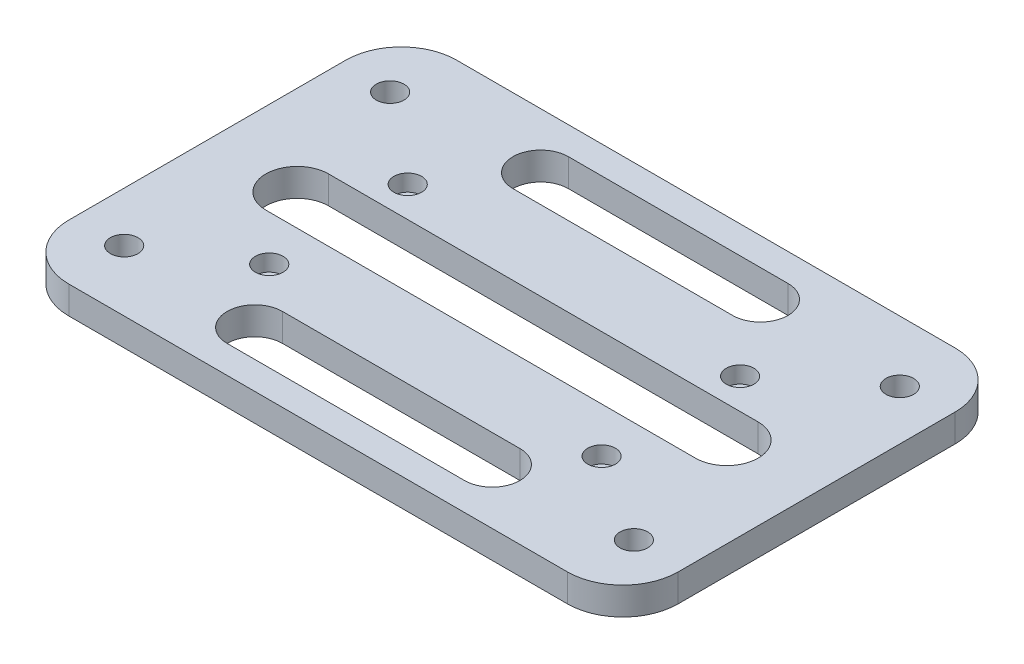
ISO-10303-21;
HEADER;
FILE_DESCRIPTION(('STEP AP214'),'2;1');
FILE_NAME('part.step','',(''),(''),'','','');
FILE_SCHEMA(('AUTOMOTIVE_DESIGN { 1 0 10303 214 1 1 1 1 }'));
ENDSEC;
DATA;
#1=APPLICATION_CONTEXT('core data for automotive mechanical design processes');
#2=APPLICATION_PROTOCOL_DEFINITION('international standard','automotive_design',2000,#1);
#3=PRODUCT_CONTEXT('',#1,'mechanical');
#4=PRODUCT('Part','Part','',(#3));
#5=PRODUCT_RELATED_PRODUCT_CATEGORY('part','',(#4));
#6=PRODUCT_DEFINITION_FORMATION('','',#4);
#7=PRODUCT_DEFINITION_CONTEXT('part definition',#1,'design');
#8=PRODUCT_DEFINITION('design','',#6,#7);
#9=PRODUCT_DEFINITION_SHAPE('','',#8);
#10=(LENGTH_UNIT() NAMED_UNIT(*) SI_UNIT(.MILLI.,.METRE.));
#11=(NAMED_UNIT(*) PLANE_ANGLE_UNIT() SI_UNIT($,.RADIAN.));
#12=(NAMED_UNIT(*) SI_UNIT($,.STERADIAN.) SOLID_ANGLE_UNIT());
#13=UNCERTAINTY_MEASURE_WITH_UNIT(LENGTH_MEASURE(1.E-05),#10,'distance_accuracy_value','');
#14=(GEOMETRIC_REPRESENTATION_CONTEXT(3) GLOBAL_UNCERTAINTY_ASSIGNED_CONTEXT((#13)) GLOBAL_UNIT_ASSIGNED_CONTEXT((#10,
#11,#12)) REPRESENTATION_CONTEXT('',''));
#15=CARTESIAN_POINT('',(0.,0.,0.));
#16=DIRECTION('',(0.,0.,1.));
#17=DIRECTION('',(1.,0.,0.));
#18=AXIS2_PLACEMENT_3D('',#15,#16,#17);
#19=CARTESIAN_POINT('',(85.,0.,-46.1767788666769));
#20=DIRECTION('',(0.,1.,0.));
#21=DIRECTION('',(0.,0.,1.));
#22=AXIS2_PLACEMENT_3D('',#19,#20,#21);
#23=CYLINDRICAL_SURFACE('',#22,1.29999999999999);
#24=CARTESIAN_POINT('',(85.,0.,-46.1767788666769));
#25=DIRECTION('',(0.,1.,0.));
#26=DIRECTION('',(0.,0.,1.));
#27=AXIS2_PLACEMENT_3D('',#24,#25,#26);
#28=CIRCLE('',#27,1.29999999999999);
#29=CARTESIAN_POINT('',(85.,0.,-44.8767788666769));
#30=VERTEX_POINT('',#29);
#31=EDGE_CURVE('E312',#30,#30,#28,.T.);
#32=ORIENTED_EDGE('',*,*,#31,.F.);
#33=EDGE_LOOP('',(#32));
#34=FACE_BOUND('',#33,.T.);
#35=CARTESIAN_POINT('',(85.,2.,-46.1767788666769));
#36=DIRECTION('',(0.,1.,0.));
#37=DIRECTION('',(0.,0.,1.));
#38=AXIS2_PLACEMENT_3D('',#35,#36,#37);
#39=CIRCLE('',#38,1.29999999999999);
#40=CARTESIAN_POINT('',(85.,2.,-44.8767788666769));
#41=VERTEX_POINT('',#40);
#42=EDGE_CURVE('E315',#41,#41,#39,.F.);
#43=ORIENTED_EDGE('',*,*,#42,.F.);
#44=EDGE_LOOP('',(#43));
#45=FACE_BOUND('',#44,.T.);
#46=ADVANCED_FACE('F35',(#34,#45),#23,.F.);
#47=CARTESIAN_POINT('',(85.,0.,-21.1767788666769));
#48=DIRECTION('',(0.,1.,0.));
#49=DIRECTION('',(0.,0.,1.));
#50=AXIS2_PLACEMENT_3D('',#47,#48,#49);
#51=CYLINDRICAL_SURFACE('',#50,1.29999999999999);
#52=CARTESIAN_POINT('',(85.,0.,-21.1767788666769));
#53=DIRECTION('',(0.,1.,0.));
#54=DIRECTION('',(0.,0.,1.));
#55=AXIS2_PLACEMENT_3D('',#52,#53,#54);
#56=CIRCLE('',#55,1.29999999999999);
#57=CARTESIAN_POINT('',(85.,0.,-19.8767788666769));
#58=VERTEX_POINT('',#57);
#59=EDGE_CURVE('E309',#58,#58,#56,.T.);
#60=ORIENTED_EDGE('',*,*,#59,.F.);
#61=EDGE_LOOP('',(#60));
#62=FACE_BOUND('',#61,.T.);
#63=CARTESIAN_POINT('',(85.,2.,-21.1767788666769));
#64=DIRECTION('',(0.,1.,0.));
#65=DIRECTION('',(0.,0.,1.));
#66=AXIS2_PLACEMENT_3D('',#63,#64,#65);
#67=CIRCLE('',#66,1.29999999999999);
#68=CARTESIAN_POINT('',(85.,2.,-19.8767788666769));
#69=VERTEX_POINT('',#68);
#70=EDGE_CURVE('E369',#69,#69,#67,.F.);
#71=ORIENTED_EDGE('',*,*,#70,.F.);
#72=EDGE_LOOP('',(#71));
#73=FACE_BOUND('',#72,.T.);
#74=ADVANCED_FACE('F440',(#62,#73),#51,.F.);
#75=CARTESIAN_POINT('',(25.,0.,-21.1767788666769));
#76=DIRECTION('',(0.,1.,0.));
#77=DIRECTION('',(0.,0.,1.));
#78=AXIS2_PLACEMENT_3D('',#75,#76,#77);
#79=CYLINDRICAL_SURFACE('',#78,1.3);
#80=CARTESIAN_POINT('',(25.,0.,-21.1767788666769));
#81=DIRECTION('',(0.,1.,0.));
#82=DIRECTION('',(0.,0.,1.));
#83=AXIS2_PLACEMENT_3D('',#80,#81,#82);
#84=CIRCLE('',#83,1.3);
#85=CARTESIAN_POINT('',(25.,0.,-19.8767788666769));
#86=VERTEX_POINT('',#85);
#87=EDGE_CURVE('E305',#86,#86,#84,.T.);
#88=ORIENTED_EDGE('',*,*,#87,.F.);
#89=EDGE_LOOP('',(#88));
#90=FACE_BOUND('',#89,.T.);
#91=CARTESIAN_POINT('',(25.,2.,-21.1767788666769));
#92=DIRECTION('',(0.,1.,0.));
#93=DIRECTION('',(0.,0.,1.));
#94=AXIS2_PLACEMENT_3D('',#91,#92,#93);
#95=CIRCLE('',#94,1.3);
#96=CARTESIAN_POINT('',(25.,2.,-19.8767788666769));
#97=VERTEX_POINT('',#96);
#98=EDGE_CURVE('E366',#97,#97,#95,.F.);
#99=ORIENTED_EDGE('',*,*,#98,.F.);
#100=EDGE_LOOP('',(#99));
#101=FACE_BOUND('',#100,.T.);
#102=ADVANCED_FACE('F446',(#90,#101),#79,.F.);
#103=CARTESIAN_POINT('',(25.,0.,-46.1767788666769));
#104=DIRECTION('',(0.,1.,0.));
#105=DIRECTION('',(0.,0.,1.));
#106=AXIS2_PLACEMENT_3D('',#103,#104,#105);
#107=CYLINDRICAL_SURFACE('',#106,1.3);
#108=CARTESIAN_POINT('',(25.,0.,-46.1767788666769));
#109=DIRECTION('',(0.,1.,0.));
#110=DIRECTION('',(0.,0.,1.));
#111=AXIS2_PLACEMENT_3D('',#108,#109,#110);
#112=CIRCLE('',#111,1.3);
#113=CARTESIAN_POINT('',(25.,0.,-44.8767788666769));
#114=VERTEX_POINT('',#113);
#115=EDGE_CURVE('E308',#114,#114,#112,.T.);
#116=ORIENTED_EDGE('',*,*,#115,.F.);
#117=EDGE_LOOP('',(#116));
#118=FACE_BOUND('',#117,.T.);
#119=CARTESIAN_POINT('',(25.,2.,-46.1767788666769));
#120=DIRECTION('',(0.,1.,0.));
#121=DIRECTION('',(0.,0.,1.));
#122=AXIS2_PLACEMENT_3D('',#119,#120,#121);
#123=CIRCLE('',#122,1.3);
#124=CARTESIAN_POINT('',(25.,2.,-44.8767788666769));
#125=VERTEX_POINT('',#124);
#126=EDGE_CURVE('E302',#125,#125,#123,.F.);
#127=ORIENTED_EDGE('',*,*,#126,.F.);
#128=EDGE_LOOP('',(#127));
#129=FACE_BOUND('',#128,.T.);
#130=ADVANCED_FACE('F467',(#118,#129),#107,.F.);
#131=CARTESIAN_POINT('',(0.,5.,0.));
#132=DIRECTION('',(1.,0.,0.));
#133=DIRECTION('',(0.,0.,-1.));
#134=AXIS2_PLACEMENT_3D('',#131,#132,#133);
#135=PLANE('',#134);
#136=DIRECTION('',(0.,0.,1.));
#137=VECTOR('',#136,1.);
#138=CARTESIAN_POINT('',(0.,0.,0.));
#139=LINE('',#138,#137);
#140=CARTESIAN_POINT('',(0.,0.,-60.));
#141=VERTEX_POINT('',#140);
#142=CARTESIAN_POINT('',(0.,0.,-10.));
#143=VERTEX_POINT('',#142);
#144=EDGE_CURVE('E340',#141,#143,#139,.T.);
#145=ORIENTED_EDGE('',*,*,#144,.T.);
#146=DIRECTION('',(0.,-1.,0.));
#147=VECTOR('',#146,1.);
#148=CARTESIAN_POINT('',(0.,5.,-10.));
#149=LINE('',#148,#147);
#150=CARTESIAN_POINT('',(0.,5.,-10.));
#151=VERTEX_POINT('',#150);
#152=EDGE_CURVE('E11',#143,#151,#149,.F.);
#153=ORIENTED_EDGE('',*,*,#152,.T.);
#154=DIRECTION('',(0.,0.,1.));
#155=VECTOR('',#154,1.);
#156=CARTESIAN_POINT('',(0.,5.,0.));
#157=LINE('',#156,#155);
#158=CARTESIAN_POINT('',(0.,5.,-60.));
#159=VERTEX_POINT('',#158);
#160=EDGE_CURVE('E343',#159,#151,#157,.T.);
#161=ORIENTED_EDGE('',*,*,#160,.F.);
#162=DIRECTION('',(0.,-1.,0.));
#163=VECTOR('',#162,1.);
#164=CARTESIAN_POINT('',(0.,5.,-60.));
#165=LINE('',#164,#163);
#166=EDGE_CURVE('E43',#159,#141,#165,.T.);
#167=ORIENTED_EDGE('',*,*,#166,.T.);
#168=EDGE_LOOP('',(#145,#153,#161,#167));
#169=FACE_BOUND('',#168,.T.);
#170=ADVANCED_FACE('F406',(#169),#135,.F.);
#171=CARTESIAN_POINT('',(0.,5.,0.));
#172=DIRECTION('',(0.,0.,-1.));
#173=DIRECTION('',(-1.,0.,0.));
#174=AXIS2_PLACEMENT_3D('',#171,#172,#173);
#175=PLANE('',#174);
#176=DIRECTION('',(1.,0.,0.));
#177=VECTOR('',#176,1.);
#178=CARTESIAN_POINT('',(0.,0.,0.));
#179=LINE('',#178,#177);
#180=CARTESIAN_POINT('',(10.,0.,0.));
#181=VERTEX_POINT('',#180);
#182=CARTESIAN_POINT('',(100.,0.,0.));
#183=VERTEX_POINT('',#182);
#184=EDGE_CURVE('E357',#181,#183,#179,.T.);
#185=ORIENTED_EDGE('',*,*,#184,.T.);
#186=DIRECTION('',(0.,-1.,0.));
#187=VECTOR('',#186,1.);
#188=CARTESIAN_POINT('',(100.,5.,0.));
#189=LINE('',#188,#187);
#190=CARTESIAN_POINT('',(100.,5.,0.));
#191=VERTEX_POINT('',#190);
#192=EDGE_CURVE('E50',#183,#191,#189,.F.);
#193=ORIENTED_EDGE('',*,*,#192,.T.);
#194=DIRECTION('',(1.,0.,0.));
#195=VECTOR('',#194,1.);
#196=CARTESIAN_POINT('',(0.,5.,0.));
#197=LINE('',#196,#195);
#198=CARTESIAN_POINT('',(10.,5.,0.));
#199=VERTEX_POINT('',#198);
#200=EDGE_CURVE('E345',#199,#191,#197,.T.);
#201=ORIENTED_EDGE('',*,*,#200,.F.);
#202=DIRECTION('',(0.,-1.,0.));
#203=VECTOR('',#202,1.);
#204=CARTESIAN_POINT('',(10.,5.,0.));
#205=LINE('',#204,#203);
#206=EDGE_CURVE('E398',#199,#181,#205,.T.);
#207=ORIENTED_EDGE('',*,*,#206,.T.);
#208=EDGE_LOOP('',(#185,#193,#201,#207));
#209=FACE_BOUND('',#208,.T.);
#210=ADVANCED_FACE('F416',(#209),#175,.F.);
#211=CARTESIAN_POINT('',(110.,5.,0.));
#212=DIRECTION('',(-1.,0.,0.));
#213=DIRECTION('',(0.,0.,1.));
#214=AXIS2_PLACEMENT_3D('',#211,#212,#213);
#215=PLANE('',#214);
#216=DIRECTION('',(0.,0.,-1.));
#217=VECTOR('',#216,1.);
#218=CARTESIAN_POINT('',(110.,0.,0.));
#219=LINE('',#218,#217);
#220=CARTESIAN_POINT('',(110.,0.,-10.));
#221=VERTEX_POINT('',#220);
#222=CARTESIAN_POINT('',(110.,0.,-60.));
#223=VERTEX_POINT('',#222);
#224=EDGE_CURVE('E359',#221,#223,#219,.T.);
#225=ORIENTED_EDGE('',*,*,#224,.T.);
#226=DIRECTION('',(0.,-1.,0.));
#227=VECTOR('',#226,1.);
#228=CARTESIAN_POINT('',(110.,5.,-60.));
#229=LINE('',#228,#227);
#230=CARTESIAN_POINT('',(110.,5.,-60.));
#231=VERTEX_POINT('',#230);
#232=EDGE_CURVE('E389',#223,#231,#229,.F.);
#233=ORIENTED_EDGE('',*,*,#232,.T.);
#234=DIRECTION('',(0.,0.,-1.));
#235=VECTOR('',#234,1.);
#236=CARTESIAN_POINT('',(110.,5.,0.));
#237=LINE('',#236,#235);
#238=CARTESIAN_POINT('',(110.,5.,-10.));
#239=VERTEX_POINT('',#238);
#240=EDGE_CURVE('E348',#239,#231,#237,.T.);
#241=ORIENTED_EDGE('',*,*,#240,.F.);
#242=DIRECTION('',(0.,-1.,0.));
#243=VECTOR('',#242,1.);
#244=CARTESIAN_POINT('',(110.,5.,-10.));
#245=LINE('',#244,#243);
#246=EDGE_CURVE('E386',#239,#221,#245,.T.);
#247=ORIENTED_EDGE('',*,*,#246,.T.);
#248=EDGE_LOOP('',(#225,#233,#241,#247));
#249=FACE_BOUND('',#248,.T.);
#250=ADVANCED_FACE('F425',(#249),#215,.F.);
#251=CARTESIAN_POINT('',(0.,5.,-70.));
#252=DIRECTION('',(0.,0.,1.));
#253=DIRECTION('',(1.,0.,0.));
#254=AXIS2_PLACEMENT_3D('',#251,#252,#253);
#255=PLANE('',#254);
#256=DIRECTION('',(-1.,0.,0.));
#257=VECTOR('',#256,1.);
#258=CARTESIAN_POINT('',(0.,5.,-70.));
#259=LINE('',#258,#257);
#260=CARTESIAN_POINT('',(100.,5.,-70.));
#261=VERTEX_POINT('',#260);
#262=CARTESIAN_POINT('',(10.,5.,-70.));
#263=VERTEX_POINT('',#262);
#264=EDGE_CURVE('E351',#261,#263,#259,.T.);
#265=ORIENTED_EDGE('',*,*,#264,.F.);
#266=DIRECTION('',(0.,-1.,0.));
#267=VECTOR('',#266,1.);
#268=CARTESIAN_POINT('',(100.,5.,-70.));
#269=LINE('',#268,#267);
#270=CARTESIAN_POINT('',(100.,0.,-70.));
#271=VERTEX_POINT('',#270);
#272=EDGE_CURVE('E375',#261,#271,#269,.T.);
#273=ORIENTED_EDGE('',*,*,#272,.T.);
#274=DIRECTION('',(-1.,0.,0.));
#275=VECTOR('',#274,1.);
#276=CARTESIAN_POINT('',(0.,0.,-70.));
#277=LINE('',#276,#275);
#278=CARTESIAN_POINT('',(10.,0.,-70.));
#279=VERTEX_POINT('',#278);
#280=EDGE_CURVE('E346',#271,#279,#277,.T.);
#281=ORIENTED_EDGE('',*,*,#280,.T.);
#282=DIRECTION('',(0.,-1.,0.));
#283=VECTOR('',#282,1.);
#284=CARTESIAN_POINT('',(10.,5.,-70.));
#285=LINE('',#284,#283);
#286=EDGE_CURVE('E354',#279,#263,#285,.F.);
#287=ORIENTED_EDGE('',*,*,#286,.T.);
#288=EDGE_LOOP('',(#265,#273,#281,#287));
#289=FACE_BOUND('',#288,.T.);
#290=ADVANCED_FACE('F433',(#289),#255,.F.);
#291=CARTESIAN_POINT('',(0.,5.,0.));
#292=DIRECTION('',(0.,-1.,0.));
#293=DIRECTION('',(0.,0.,-1.));
#294=AXIS2_PLACEMENT_3D('',#291,#292,#293);
#295=PLANE('',#294);
#296=DIRECTION('',(1.,0.,0.));
#297=VECTOR('',#296,1.);
#298=CARTESIAN_POINT('',(35.1751469043261,5.,-55.));
#299=LINE('',#298,#297);
#300=CARTESIAN_POINT('',(35.1751469043261,5.,-55.));
#301=VERTEX_POINT('',#300);
#302=CARTESIAN_POINT('',(74.8248530956739,5.,-55.));
#303=VERTEX_POINT('',#302);
#304=EDGE_CURVE('E207',#301,#303,#299,.T.);
#305=ORIENTED_EDGE('',*,*,#304,.F.);
#306=CARTESIAN_POINT('',(35.1751469043261,5.,-60.));
#307=DIRECTION('',(0.,1.,0.));
#308=DIRECTION('',(0.,0.,1.));
#309=AXIS2_PLACEMENT_3D('',#306,#307,#308);
#310=CIRCLE('',#309,5.00000000000001);
#311=CARTESIAN_POINT('',(35.1751469043261,5.,-65.));
#312=VERTEX_POINT('',#311);
#313=EDGE_CURVE('E180',#312,#301,#310,.T.);
#314=ORIENTED_EDGE('',*,*,#313,.F.);
#315=DIRECTION('',(-1.,0.,0.));
#316=VECTOR('',#315,1.);
#317=CARTESIAN_POINT('',(35.1751469043261,5.,-65.));
#318=LINE('',#317,#316);
#319=CARTESIAN_POINT('',(74.8248530956739,5.,-65.));
#320=VERTEX_POINT('',#319);
#321=EDGE_CURVE('E198',#320,#312,#318,.T.);
#322=ORIENTED_EDGE('',*,*,#321,.F.);
#323=CARTESIAN_POINT('',(74.8248530956739,5.,-60.));
#324=DIRECTION('',(0.,1.,0.));
#325=DIRECTION('',(0.,0.,1.));
#326=AXIS2_PLACEMENT_3D('',#323,#324,#325);
#327=CIRCLE('',#326,5.00000000000001);
#328=EDGE_CURVE('E201',#303,#320,#327,.T.);
#329=ORIENTED_EDGE('',*,*,#328,.F.);
#330=EDGE_LOOP('',(#305,#314,#322,#329));
#331=FACE_BOUND('',#330,.T.);
#332=DIRECTION('',(1.,0.,0.));
#333=VECTOR('',#332,1.);
#334=CARTESIAN_POINT('',(16.2260905317542,5.,-29.3402659652281));
#335=LINE('',#334,#333);
#336=CARTESIAN_POINT('',(16.2260905317542,5.,-29.3402659652281));
#337=VERTEX_POINT('',#336);
#338=CARTESIAN_POINT('',(93.7739094682458,5.,-29.3402659652281));
#339=VERTEX_POINT('',#338);
#340=EDGE_CURVE('E234',#337,#339,#335,.T.);
#341=ORIENTED_EDGE('',*,*,#340,.F.);
#342=CARTESIAN_POINT('',(16.2260905317542,5.,-35.));
#343=DIRECTION('',(0.,1.,0.));
#344=DIRECTION('',(0.,0.,1.));
#345=AXIS2_PLACEMENT_3D('',#342,#343,#344);
#346=CIRCLE('',#345,5.65973403477189);
#347=CARTESIAN_POINT('',(16.2260905317542,5.,-40.6597340347719));
#348=VERTEX_POINT('',#347);
#349=EDGE_CURVE('E232',#348,#337,#346,.T.);
#350=ORIENTED_EDGE('',*,*,#349,.F.);
#351=DIRECTION('',(-1.,0.,0.));
#352=VECTOR('',#351,1.);
#353=CARTESIAN_POINT('',(16.2260905317542,5.,-40.6597340347719));
#354=LINE('',#353,#352);
#355=CARTESIAN_POINT('',(93.7739094682458,5.,-40.6597340347719));
#356=VERTEX_POINT('',#355);
#357=EDGE_CURVE('E222',#356,#348,#354,.T.);
#358=ORIENTED_EDGE('',*,*,#357,.F.);
#359=CARTESIAN_POINT('',(93.7739094682458,5.,-35.));
#360=DIRECTION('',(0.,1.,0.));
#361=DIRECTION('',(0.,0.,1.));
#362=AXIS2_PLACEMENT_3D('',#359,#360,#361);
#363=CIRCLE('',#362,5.65973403477189);
#364=EDGE_CURVE('E238',#339,#356,#363,.T.);
#365=ORIENTED_EDGE('',*,*,#364,.F.);
#366=EDGE_LOOP('',(#341,#350,#358,#365));
#367=FACE_BOUND('',#366,.T.);
#368=DIRECTION('',(1.,0.,0.));
#369=VECTOR('',#368,1.);
#370=CARTESIAN_POINT('',(33.5667372332332,5.,-5.));
#371=LINE('',#370,#369);
#372=CARTESIAN_POINT('',(33.5667372332332,5.,-5.));
#373=VERTEX_POINT('',#372);
#374=CARTESIAN_POINT('',(76.4332627667668,5.,-5.));
#375=VERTEX_POINT('',#374);
#376=EDGE_CURVE('E266',#373,#375,#371,.T.);
#377=ORIENTED_EDGE('',*,*,#376,.F.);
#378=CARTESIAN_POINT('',(33.5667372332332,5.,-10.));
#379=DIRECTION('',(0.,1.,0.));
#380=DIRECTION('',(0.,0.,1.));
#381=AXIS2_PLACEMENT_3D('',#378,#379,#380);
#382=CIRCLE('',#381,5.);
#383=CARTESIAN_POINT('',(33.5667372332332,5.,-15.));
#384=VERTEX_POINT('',#383);
#385=EDGE_CURVE('E264',#384,#373,#382,.T.);
#386=ORIENTED_EDGE('',*,*,#385,.F.);
#387=DIRECTION('',(-1.,0.,0.));
#388=VECTOR('',#387,1.);
#389=CARTESIAN_POINT('',(33.5667372332332,5.,-15.));
#390=LINE('',#389,#388);
#391=CARTESIAN_POINT('',(76.4332627667668,5.,-15.));
#392=VERTEX_POINT('',#391);
#393=EDGE_CURVE('E254',#392,#384,#390,.T.);
#394=ORIENTED_EDGE('',*,*,#393,.F.);
#395=CARTESIAN_POINT('',(76.4332627667668,5.,-10.));
#396=DIRECTION('',(0.,1.,0.));
#397=DIRECTION('',(0.,0.,1.));
#398=AXIS2_PLACEMENT_3D('',#395,#396,#397);
#399=CIRCLE('',#398,5.);
#400=EDGE_CURVE('E269',#375,#392,#399,.T.);
#401=ORIENTED_EDGE('',*,*,#400,.F.);
#402=EDGE_LOOP('',(#377,#386,#394,#401));
#403=FACE_BOUND('',#402,.T.);
#404=CARTESIAN_POINT('',(85.,5.,-46.1767788666769));
#405=DIRECTION('',(0.,1.,0.));
#406=DIRECTION('',(0.,0.,1.));
#407=AXIS2_PLACEMENT_3D('',#404,#405,#406);
#408=CIRCLE('',#407,2.5);
#409=CARTESIAN_POINT('',(85.,5.,-43.6767788666769));
#410=VERTEX_POINT('',#409);
#411=EDGE_CURVE('E214',#410,#410,#408,.T.);
#412=ORIENTED_EDGE('',*,*,#411,.F.);
#413=EDGE_LOOP('',(#412));
#414=FACE_BOUND('',#413,.T.);
#415=CARTESIAN_POINT('',(85.,5.,-21.1767788666769));
#416=DIRECTION('',(0.,1.,0.));
#417=DIRECTION('',(0.,0.,1.));
#418=AXIS2_PLACEMENT_3D('',#415,#416,#417);
#419=CIRCLE('',#418,2.5);
#420=CARTESIAN_POINT('',(85.,5.,-18.6767788666769));
#421=VERTEX_POINT('',#420);
#422=EDGE_CURVE('E291',#421,#421,#419,.T.);
#423=ORIENTED_EDGE('',*,*,#422,.F.);
#424=EDGE_LOOP('',(#423));
#425=FACE_BOUND('',#424,.T.);
#426=CARTESIAN_POINT('',(25.,5.,-21.1767788666769));
#427=DIRECTION('',(0.,1.,0.));
#428=DIRECTION('',(0.,0.,1.));
#429=AXIS2_PLACEMENT_3D('',#426,#427,#428);
#430=CIRCLE('',#429,2.5);
#431=CARTESIAN_POINT('',(25.,5.,-18.6767788666769));
#432=VERTEX_POINT('',#431);
#433=EDGE_CURVE('E285',#432,#432,#430,.T.);
#434=ORIENTED_EDGE('',*,*,#433,.F.);
#435=EDGE_LOOP('',(#434));
#436=FACE_BOUND('',#435,.T.);
#437=CARTESIAN_POINT('',(25.,5.,-46.1767788666769));
#438=DIRECTION('',(0.,1.,0.));
#439=DIRECTION('',(0.,0.,1.));
#440=AXIS2_PLACEMENT_3D('',#437,#438,#439);
#441=CIRCLE('',#440,2.5);
#442=CARTESIAN_POINT('',(25.,5.,-43.6767788666769));
#443=VERTEX_POINT('',#442);
#444=EDGE_CURVE('E284',#443,#443,#441,.T.);
#445=ORIENTED_EDGE('',*,*,#444,.F.);
#446=EDGE_LOOP('',(#445));
#447=FACE_BOUND('',#446,.T.);
#448=CARTESIAN_POINT('',(9.00000000000001,5.,-11.));
#449=DIRECTION('',(0.,1.,0.));
#450=DIRECTION('',(0.,0.,1.));
#451=AXIS2_PLACEMENT_3D('',#448,#449,#450);
#452=CIRCLE('',#451,2.5);
#453=CARTESIAN_POINT('',(9.00000000000001,5.,-8.5));
#454=VERTEX_POINT('',#453);
#455=EDGE_CURVE('E320',#454,#454,#452,.T.);
#456=ORIENTED_EDGE('',*,*,#455,.F.);
#457=EDGE_LOOP('',(#456));
#458=FACE_BOUND('',#457,.T.);
#459=CARTESIAN_POINT('',(101.,5.,-11.));
#460=DIRECTION('',(0.,1.,0.));
#461=DIRECTION('',(0.,0.,1.));
#462=AXIS2_PLACEMENT_3D('',#459,#460,#461);
#463=CIRCLE('',#462,2.5);
#464=CARTESIAN_POINT('',(101.,5.,-8.50000000000002));
#465=VERTEX_POINT('',#464);
#466=EDGE_CURVE('E326',#465,#465,#463,.T.);
#467=ORIENTED_EDGE('',*,*,#466,.F.);
#468=EDGE_LOOP('',(#467));
#469=FACE_BOUND('',#468,.T.);
#470=CARTESIAN_POINT('',(101.,5.,-59.));
#471=DIRECTION('',(0.,1.,0.));
#472=DIRECTION('',(0.,0.,1.));
#473=AXIS2_PLACEMENT_3D('',#470,#471,#472);
#474=CIRCLE('',#473,2.5);
#475=CARTESIAN_POINT('',(101.,5.,-56.5));
#476=VERTEX_POINT('',#475);
#477=EDGE_CURVE('E332',#476,#476,#474,.T.);
#478=ORIENTED_EDGE('',*,*,#477,.F.);
#479=EDGE_LOOP('',(#478));
#480=FACE_BOUND('',#479,.T.);
#481=CARTESIAN_POINT('',(9.00000000000001,5.,-59.));
#482=DIRECTION('',(0.,1.,0.));
#483=DIRECTION('',(0.,0.,1.));
#484=AXIS2_PLACEMENT_3D('',#481,#482,#483);
#485=CIRCLE('',#484,2.5);
#486=CARTESIAN_POINT('',(9.00000000000001,5.,-56.5));
#487=VERTEX_POINT('',#486);
#488=EDGE_CURVE('E319',#487,#487,#485,.T.);
#489=ORIENTED_EDGE('',*,*,#488,.F.);
#490=EDGE_LOOP('',(#489));
#491=FACE_BOUND('',#490,.T.);
#492=ORIENTED_EDGE('',*,*,#240,.T.);
#493=CARTESIAN_POINT('',(100.,5.,-60.));
#494=DIRECTION('',(0.,-1.,0.));
#495=DIRECTION('',(0.,0.,-1.));
#496=AXIS2_PLACEMENT_3D('',#493,#494,#495);
#497=CIRCLE('',#496,10.);
#498=EDGE_CURVE('E396',#231,#261,#497,.F.);
#499=ORIENTED_EDGE('',*,*,#498,.T.);
#500=ORIENTED_EDGE('',*,*,#264,.T.);
#501=CARTESIAN_POINT('',(10.,5.,-60.));
#502=DIRECTION('',(0.,-1.,0.));
#503=DIRECTION('',(0.,0.,-1.));
#504=AXIS2_PLACEMENT_3D('',#501,#502,#503);
#505=CIRCLE('',#504,10.);
#506=EDGE_CURVE('E391',#263,#159,#505,.F.);
#507=ORIENTED_EDGE('',*,*,#506,.T.);
#508=ORIENTED_EDGE('',*,*,#160,.T.);
#509=CARTESIAN_POINT('',(10.,5.,-10.));
#510=DIRECTION('',(0.,-1.,0.));
#511=DIRECTION('',(0.,0.,-1.));
#512=AXIS2_PLACEMENT_3D('',#509,#510,#511);
#513=CIRCLE('',#512,10.);
#514=EDGE_CURVE('E57',#151,#199,#513,.F.);
#515=ORIENTED_EDGE('',*,*,#514,.T.);
#516=ORIENTED_EDGE('',*,*,#200,.T.);
#517=CARTESIAN_POINT('',(100.,5.,-10.));
#518=DIRECTION('',(0.,-1.,0.));
#519=DIRECTION('',(0.,0.,-1.));
#520=AXIS2_PLACEMENT_3D('',#517,#518,#519);
#521=CIRCLE('',#520,10.);
#522=EDGE_CURVE('E394',#191,#239,#521,.F.);
#523=ORIENTED_EDGE('',*,*,#522,.T.);
#524=EDGE_LOOP('',(#492,#499,#500,#507,#508,#515,#516,#523));
#525=FACE_BOUND('',#524,.T.);
#526=ADVANCED_FACE('F418',(#331,#367,#403,#414,#425,#436,#447,#458,#469,#480,#491,#525),#295,.F.);
#527=CARTESIAN_POINT('',(0.,0.,0.));
#528=DIRECTION('',(0.,-1.,0.));
#529=DIRECTION('',(0.,0.,-1.));
#530=AXIS2_PLACEMENT_3D('',#527,#528,#529);
#531=PLANE('',#530);
#532=CARTESIAN_POINT('',(35.1751469043261,0.,-60.));
#533=DIRECTION('',(0.,1.,0.));
#534=DIRECTION('',(0.,0.,1.));
#535=AXIS2_PLACEMENT_3D('',#532,#533,#534);
#536=CIRCLE('',#535,5.00000000000001);
#537=CARTESIAN_POINT('',(35.1751469043261,0.,-65.));
#538=VERTEX_POINT('',#537);
#539=CARTESIAN_POINT('',(35.1751469043261,0.,-55.));
#540=VERTEX_POINT('',#539);
#541=EDGE_CURVE('E177',#538,#540,#536,.T.);
#542=ORIENTED_EDGE('',*,*,#541,.T.);
#543=DIRECTION('',(1.,0.,0.));
#544=VECTOR('',#543,1.);
#545=CARTESIAN_POINT('',(35.1751469043261,0.,-55.));
#546=LINE('',#545,#544);
#547=CARTESIAN_POINT('',(74.8248530956739,0.,-55.));
#548=VERTEX_POINT('',#547);
#549=EDGE_CURVE('E189',#540,#548,#546,.T.);
#550=ORIENTED_EDGE('',*,*,#549,.T.);
#551=CARTESIAN_POINT('',(74.8248530956739,0.,-60.));
#552=DIRECTION('',(0.,1.,0.));
#553=DIRECTION('',(0.,0.,1.));
#554=AXIS2_PLACEMENT_3D('',#551,#552,#553);
#555=CIRCLE('',#554,5.00000000000001);
#556=CARTESIAN_POINT('',(74.8248530956739,0.,-65.));
#557=VERTEX_POINT('',#556);
#558=EDGE_CURVE('E193',#548,#557,#555,.T.);
#559=ORIENTED_EDGE('',*,*,#558,.T.);
#560=DIRECTION('',(-1.,0.,0.));
#561=VECTOR('',#560,1.);
#562=CARTESIAN_POINT('',(35.1751469043261,0.,-65.));
#563=LINE('',#562,#561);
#564=EDGE_CURVE('E185',#557,#538,#563,.T.);
#565=ORIENTED_EDGE('',*,*,#564,.T.);
#566=EDGE_LOOP('',(#542,#550,#559,#565));
#567=FACE_BOUND('',#566,.T.);
#568=CARTESIAN_POINT('',(16.2260905317542,0.,-35.));
#569=DIRECTION('',(0.,1.,0.));
#570=DIRECTION('',(0.,0.,1.));
#571=AXIS2_PLACEMENT_3D('',#568,#569,#570);
#572=CIRCLE('',#571,5.65973403477189);
#573=CARTESIAN_POINT('',(16.2260905317542,0.,-40.6597340347719));
#574=VERTEX_POINT('',#573);
#575=CARTESIAN_POINT('',(16.2260905317542,0.,-29.3402659652281));
#576=VERTEX_POINT('',#575);
#577=EDGE_CURVE('E218',#574,#576,#572,.T.);
#578=ORIENTED_EDGE('',*,*,#577,.T.);
#579=DIRECTION('',(1.,0.,0.));
#580=VECTOR('',#579,1.);
#581=CARTESIAN_POINT('',(16.2260905317542,0.,-29.3402659652281));
#582=LINE('',#581,#580);
#583=CARTESIAN_POINT('',(93.7739094682458,0.,-29.3402659652281));
#584=VERTEX_POINT('',#583);
#585=EDGE_CURVE('E221',#576,#584,#582,.T.);
#586=ORIENTED_EDGE('',*,*,#585,.T.);
#587=CARTESIAN_POINT('',(93.7739094682458,0.,-35.));
#588=DIRECTION('',(0.,1.,0.));
#589=DIRECTION('',(0.,0.,1.));
#590=AXIS2_PLACEMENT_3D('',#587,#588,#589);
#591=CIRCLE('',#590,5.65973403477189);
#592=CARTESIAN_POINT('',(93.7739094682458,0.,-40.6597340347719));
#593=VERTEX_POINT('',#592);
#594=EDGE_CURVE('E225',#584,#593,#591,.T.);
#595=ORIENTED_EDGE('',*,*,#594,.T.);
#596=DIRECTION('',(-1.,0.,0.));
#597=VECTOR('',#596,1.);
#598=CARTESIAN_POINT('',(16.2260905317542,0.,-40.6597340347719));
#599=LINE('',#598,#597);
#600=EDGE_CURVE('E228',#593,#574,#599,.T.);
#601=ORIENTED_EDGE('',*,*,#600,.T.);
#602=EDGE_LOOP('',(#578,#586,#595,#601));
#603=FACE_BOUND('',#602,.T.);
#604=CARTESIAN_POINT('',(33.5667372332332,0.,-10.));
#605=DIRECTION('',(0.,1.,0.));
#606=DIRECTION('',(0.,0.,1.));
#607=AXIS2_PLACEMENT_3D('',#604,#605,#606);
#608=CIRCLE('',#607,5.);
#609=CARTESIAN_POINT('',(33.5667372332332,0.,-15.));
#610=VERTEX_POINT('',#609);
#611=CARTESIAN_POINT('',(33.5667372332332,0.,-5.));
#612=VERTEX_POINT('',#611);
#613=EDGE_CURVE('E250',#610,#612,#608,.T.);
#614=ORIENTED_EDGE('',*,*,#613,.T.);
#615=DIRECTION('',(1.,0.,0.));
#616=VECTOR('',#615,1.);
#617=CARTESIAN_POINT('',(33.5667372332332,0.,-5.));
#618=LINE('',#617,#616);
#619=CARTESIAN_POINT('',(76.4332627667668,0.,-5.));
#620=VERTEX_POINT('',#619);
#621=EDGE_CURVE('E253',#612,#620,#618,.T.);
#622=ORIENTED_EDGE('',*,*,#621,.T.);
#623=CARTESIAN_POINT('',(76.4332627667668,0.,-10.));
#624=DIRECTION('',(0.,1.,0.));
#625=DIRECTION('',(0.,0.,1.));
#626=AXIS2_PLACEMENT_3D('',#623,#624,#625);
#627=CIRCLE('',#626,5.);
#628=CARTESIAN_POINT('',(76.4332627667668,0.,-15.));
#629=VERTEX_POINT('',#628);
#630=EDGE_CURVE('E257',#620,#629,#627,.T.);
#631=ORIENTED_EDGE('',*,*,#630,.T.);
#632=DIRECTION('',(-1.,0.,0.));
#633=VECTOR('',#632,1.);
#634=CARTESIAN_POINT('',(33.5667372332332,0.,-15.));
#635=LINE('',#634,#633);
#636=EDGE_CURVE('E260',#629,#610,#635,.T.);
#637=ORIENTED_EDGE('',*,*,#636,.T.);
#638=EDGE_LOOP('',(#614,#622,#631,#637));
#639=FACE_BOUND('',#638,.T.);
#640=CARTESIAN_POINT('',(9.00000000000001,0.,-11.));
#641=DIRECTION('',(0.,1.,0.));
#642=DIRECTION('',(0.,0.,1.));
#643=AXIS2_PLACEMENT_3D('',#640,#641,#642);
#644=CIRCLE('',#643,2.5);
#645=CARTESIAN_POINT('',(9.00000000000001,0.,-8.5));
#646=VERTEX_POINT('',#645);
#647=EDGE_CURVE('E316',#646,#646,#644,.T.);
#648=ORIENTED_EDGE('',*,*,#647,.T.);
#649=EDGE_LOOP('',(#648));
#650=FACE_BOUND('',#649,.T.);
#651=CARTESIAN_POINT('',(101.,0.,-11.));
#652=DIRECTION('',(0.,1.,0.));
#653=DIRECTION('',(0.,0.,1.));
#654=AXIS2_PLACEMENT_3D('',#651,#652,#653);
#655=CIRCLE('',#654,2.5);
#656=CARTESIAN_POINT('',(101.,0.,-8.50000000000002));
#657=VERTEX_POINT('',#656);
#658=EDGE_CURVE('E323',#657,#657,#655,.T.);
#659=ORIENTED_EDGE('',*,*,#658,.T.);
#660=EDGE_LOOP('',(#659));
#661=FACE_BOUND('',#660,.T.);
#662=CARTESIAN_POINT('',(101.,0.,-59.));
#663=DIRECTION('',(0.,1.,0.));
#664=DIRECTION('',(0.,0.,1.));
#665=AXIS2_PLACEMENT_3D('',#662,#663,#664);
#666=CIRCLE('',#665,2.5);
#667=CARTESIAN_POINT('',(101.,0.,-56.5));
#668=VERTEX_POINT('',#667);
#669=EDGE_CURVE('E329',#668,#668,#666,.T.);
#670=ORIENTED_EDGE('',*,*,#669,.T.);
#671=EDGE_LOOP('',(#670));
#672=FACE_BOUND('',#671,.T.);
#673=ORIENTED_EDGE('',*,*,#115,.T.);
#674=EDGE_LOOP('',(#673));
#675=FACE_BOUND('',#674,.T.);
#676=ORIENTED_EDGE('',*,*,#87,.T.);
#677=EDGE_LOOP('',(#676));
#678=FACE_BOUND('',#677,.T.);
#679=ORIENTED_EDGE('',*,*,#59,.T.);
#680=EDGE_LOOP('',(#679));
#681=FACE_BOUND('',#680,.T.);
#682=ORIENTED_EDGE('',*,*,#31,.T.);
#683=EDGE_LOOP('',(#682));
#684=FACE_BOUND('',#683,.T.);
#685=CARTESIAN_POINT('',(9.00000000000001,0.,-59.));
#686=DIRECTION('',(0.,1.,0.));
#687=DIRECTION('',(0.,0.,1.));
#688=AXIS2_PLACEMENT_3D('',#685,#686,#687);
#689=CIRCLE('',#688,2.5);
#690=CARTESIAN_POINT('',(9.00000000000001,0.,-56.5));
#691=VERTEX_POINT('',#690);
#692=EDGE_CURVE('E337',#691,#691,#689,.T.);
#693=ORIENTED_EDGE('',*,*,#692,.T.);
#694=EDGE_LOOP('',(#693));
#695=FACE_BOUND('',#694,.T.);
#696=ORIENTED_EDGE('',*,*,#280,.F.);
#697=CARTESIAN_POINT('',(100.,0.,-60.));
#698=DIRECTION('',(0.,-1.,0.));
#699=DIRECTION('',(0.,0.,-1.));
#700=AXIS2_PLACEMENT_3D('',#697,#698,#699);
#701=CIRCLE('',#700,10.);
#702=EDGE_CURVE('E384',#271,#223,#701,.T.);
#703=ORIENTED_EDGE('',*,*,#702,.T.);
#704=ORIENTED_EDGE('',*,*,#224,.F.);
#705=CARTESIAN_POINT('',(100.,0.,-10.));
#706=DIRECTION('',(0.,-1.,0.));
#707=DIRECTION('',(0.,0.,-1.));
#708=AXIS2_PLACEMENT_3D('',#705,#706,#707);
#709=CIRCLE('',#708,10.);
#710=EDGE_CURVE('E382',#221,#183,#709,.T.);
#711=ORIENTED_EDGE('',*,*,#710,.T.);
#712=ORIENTED_EDGE('',*,*,#184,.F.);
#713=CARTESIAN_POINT('',(10.,0.,-10.));
#714=DIRECTION('',(0.,-1.,0.));
#715=DIRECTION('',(0.,0.,-1.));
#716=AXIS2_PLACEMENT_3D('',#713,#714,#715);
#717=CIRCLE('',#716,10.);
#718=EDGE_CURVE('E380',#181,#143,#717,.T.);
#719=ORIENTED_EDGE('',*,*,#718,.T.);
#720=ORIENTED_EDGE('',*,*,#144,.F.);
#721=CARTESIAN_POINT('',(10.,0.,-60.));
#722=DIRECTION('',(0.,-1.,0.));
#723=DIRECTION('',(0.,0.,-1.));
#724=AXIS2_PLACEMENT_3D('',#721,#722,#723);
#725=CIRCLE('',#724,10.);
#726=EDGE_CURVE('E378',#141,#279,#725,.T.);
#727=ORIENTED_EDGE('',*,*,#726,.T.);
#728=EDGE_LOOP('',(#696,#703,#704,#711,#712,#719,#720,#727));
#729=FACE_BOUND('',#728,.T.);
#730=ADVANCED_FACE('F195',(#567,#603,#639,#650,#661,#672,#675,#678,#681,#684,#695,#729),#531,.T.);
#731=CARTESIAN_POINT('',(9.00000000000001,0.,-59.));
#732=DIRECTION('',(0.,1.,0.));
#733=DIRECTION('',(0.,0.,1.));
#734=AXIS2_PLACEMENT_3D('',#731,#732,#733);
#735=CYLINDRICAL_SURFACE('',#734,2.5);
#736=ORIENTED_EDGE('',*,*,#692,.F.);
#737=EDGE_LOOP('',(#736));
#738=FACE_BOUND('',#737,.T.);
#739=ORIENTED_EDGE('',*,*,#488,.T.);
#740=EDGE_LOOP('',(#739));
#741=FACE_BOUND('',#740,.T.);
#742=ADVANCED_FACE('F465',(#738,#741),#735,.F.);
#743=CARTESIAN_POINT('',(101.,0.,-59.));
#744=DIRECTION('',(0.,1.,0.));
#745=DIRECTION('',(0.,0.,1.));
#746=AXIS2_PLACEMENT_3D('',#743,#744,#745);
#747=CYLINDRICAL_SURFACE('',#746,2.5);
#748=ORIENTED_EDGE('',*,*,#669,.F.);
#749=EDGE_LOOP('',(#748));
#750=FACE_BOUND('',#749,.T.);
#751=ORIENTED_EDGE('',*,*,#477,.T.);
#752=EDGE_LOOP('',(#751));
#753=FACE_BOUND('',#752,.T.);
#754=ADVANCED_FACE('F461',(#750,#753),#747,.F.);
#755=CARTESIAN_POINT('',(101.,0.,-11.));
#756=DIRECTION('',(0.,1.,0.));
#757=DIRECTION('',(0.,0.,1.));
#758=AXIS2_PLACEMENT_3D('',#755,#756,#757);
#759=CYLINDRICAL_SURFACE('',#758,2.5);
#760=ORIENTED_EDGE('',*,*,#658,.F.);
#761=EDGE_LOOP('',(#760));
#762=FACE_BOUND('',#761,.T.);
#763=ORIENTED_EDGE('',*,*,#466,.T.);
#764=EDGE_LOOP('',(#763));
#765=FACE_BOUND('',#764,.T.);
#766=ADVANCED_FACE('F457',(#762,#765),#759,.F.);
#767=CARTESIAN_POINT('',(9.00000000000001,0.,-11.));
#768=DIRECTION('',(0.,1.,0.));
#769=DIRECTION('',(0.,0.,1.));
#770=AXIS2_PLACEMENT_3D('',#767,#768,#769);
#771=CYLINDRICAL_SURFACE('',#770,2.5);
#772=ORIENTED_EDGE('',*,*,#647,.F.);
#773=EDGE_LOOP('',(#772));
#774=FACE_BOUND('',#773,.T.);
#775=ORIENTED_EDGE('',*,*,#455,.T.);
#776=EDGE_LOOP('',(#775));
#777=FACE_BOUND('',#776,.T.);
#778=ADVANCED_FACE('F453',(#774,#777),#771,.F.);
#779=CARTESIAN_POINT('',(25.,2.,-46.1767788666769));
#780=DIRECTION('',(0.,1.,0.));
#781=DIRECTION('',(0.,0.,1.));
#782=AXIS2_PLACEMENT_3D('',#779,#780,#781);
#783=PLANE('',#782);
#784=CARTESIAN_POINT('',(25.,2.,-46.1767788666769));
#785=DIRECTION('',(0.,1.,0.));
#786=DIRECTION('',(0.,0.,1.));
#787=AXIS2_PLACEMENT_3D('',#784,#785,#786);
#788=CIRCLE('',#787,2.5);
#789=CARTESIAN_POINT('',(25.,2.,-43.6767788666769));
#790=VERTEX_POINT('',#789);
#791=EDGE_CURVE('E299',#790,#790,#788,.T.);
#792=ORIENTED_EDGE('',*,*,#791,.T.);
#793=EDGE_LOOP('',(#792));
#794=FACE_BOUND('',#793,.T.);
#795=ORIENTED_EDGE('',*,*,#126,.T.);
#796=EDGE_LOOP('',(#795));
#797=FACE_BOUND('',#796,.T.);
#798=ADVANCED_FACE('F456',(#794,#797),#783,.T.);
#799=CARTESIAN_POINT('',(25.,2.,-46.1767788666769));
#800=DIRECTION('',(0.,1.,0.));
#801=DIRECTION('',(0.,0.,1.));
#802=AXIS2_PLACEMENT_3D('',#799,#800,#801);
#803=CYLINDRICAL_SURFACE('',#802,2.5);
#804=ORIENTED_EDGE('',*,*,#791,.F.);
#805=EDGE_LOOP('',(#804));
#806=FACE_BOUND('',#805,.T.);
#807=ORIENTED_EDGE('',*,*,#444,.T.);
#808=EDGE_LOOP('',(#807));
#809=FACE_BOUND('',#808,.T.);
#810=ADVANCED_FACE('F668',(#806,#809),#803,.F.);
#811=CARTESIAN_POINT('',(25.,2.,-21.1767788666769));
#812=DIRECTION('',(0.,1.,0.));
#813=DIRECTION('',(0.,0.,1.));
#814=AXIS2_PLACEMENT_3D('',#811,#812,#813);
#815=PLANE('',#814);
#816=CARTESIAN_POINT('',(25.,2.,-21.1767788666769));
#817=DIRECTION('',(0.,1.,0.));
#818=DIRECTION('',(0.,0.,1.));
#819=AXIS2_PLACEMENT_3D('',#816,#817,#818);
#820=CIRCLE('',#819,2.5);
#821=CARTESIAN_POINT('',(25.,2.,-18.6767788666769));
#822=VERTEX_POINT('',#821);
#823=EDGE_CURVE('E281',#822,#822,#820,.T.);
#824=ORIENTED_EDGE('',*,*,#823,.T.);
#825=EDGE_LOOP('',(#824));
#826=FACE_BOUND('',#825,.T.);
#827=ORIENTED_EDGE('',*,*,#98,.T.);
#828=EDGE_LOOP('',(#827));
#829=FACE_BOUND('',#828,.T.);
#830=ADVANCED_FACE('F659',(#826,#829),#815,.T.);
#831=CARTESIAN_POINT('',(25.,2.,-21.1767788666769));
#832=DIRECTION('',(0.,1.,0.));
#833=DIRECTION('',(0.,0.,1.));
#834=AXIS2_PLACEMENT_3D('',#831,#832,#833);
#835=CYLINDRICAL_SURFACE('',#834,2.5);
#836=ORIENTED_EDGE('',*,*,#823,.F.);
#837=EDGE_LOOP('',(#836));
#838=FACE_BOUND('',#837,.T.);
#839=ORIENTED_EDGE('',*,*,#433,.T.);
#840=EDGE_LOOP('',(#839));
#841=FACE_BOUND('',#840,.T.);
#842=ADVANCED_FACE('F650',(#838,#841),#835,.F.);
#843=CARTESIAN_POINT('',(85.,2.,-21.1767788666769));
#844=DIRECTION('',(0.,1.,0.));
#845=DIRECTION('',(0.,0.,1.));
#846=AXIS2_PLACEMENT_3D('',#843,#844,#845);
#847=PLANE('',#846);
#848=CARTESIAN_POINT('',(85.,2.,-21.1767788666769));
#849=DIRECTION('',(0.,1.,0.));
#850=DIRECTION('',(0.,0.,1.));
#851=AXIS2_PLACEMENT_3D('',#848,#849,#850);
#852=CIRCLE('',#851,2.5);
#853=CARTESIAN_POINT('',(85.,2.,-18.6767788666769));
#854=VERTEX_POINT('',#853);
#855=EDGE_CURVE('E288',#854,#854,#852,.T.);
#856=ORIENTED_EDGE('',*,*,#855,.T.);
#857=EDGE_LOOP('',(#856));
#858=FACE_BOUND('',#857,.T.);
#859=ORIENTED_EDGE('',*,*,#70,.T.);
#860=EDGE_LOOP('',(#859));
#861=FACE_BOUND('',#860,.T.);
#862=ADVANCED_FACE('F641',(#858,#861),#847,.T.);
#863=CARTESIAN_POINT('',(85.,2.,-21.1767788666769));
#864=DIRECTION('',(0.,1.,0.));
#865=DIRECTION('',(0.,0.,1.));
#866=AXIS2_PLACEMENT_3D('',#863,#864,#865);
#867=CYLINDRICAL_SURFACE('',#866,2.5);
#868=ORIENTED_EDGE('',*,*,#855,.F.);
#869=EDGE_LOOP('',(#868));
#870=FACE_BOUND('',#869,.T.);
#871=ORIENTED_EDGE('',*,*,#422,.T.);
#872=EDGE_LOOP('',(#871));
#873=FACE_BOUND('',#872,.T.);
#874=ADVANCED_FACE('F632',(#870,#873),#867,.F.);
#875=CARTESIAN_POINT('',(85.,2.,-46.1767788666769));
#876=DIRECTION('',(0.,1.,0.));
#877=DIRECTION('',(0.,0.,1.));
#878=AXIS2_PLACEMENT_3D('',#875,#876,#877);
#879=PLANE('',#878);
#880=CARTESIAN_POINT('',(85.,2.,-46.1767788666769));
#881=DIRECTION('',(0.,1.,0.));
#882=DIRECTION('',(0.,0.,1.));
#883=AXIS2_PLACEMENT_3D('',#880,#881,#882);
#884=CIRCLE('',#883,2.5);
#885=CARTESIAN_POINT('',(85.,2.,-43.6767788666769));
#886=VERTEX_POINT('',#885);
#887=EDGE_CURVE('E294',#886,#886,#884,.T.);
#888=ORIENTED_EDGE('',*,*,#887,.T.);
#889=EDGE_LOOP('',(#888));
#890=FACE_BOUND('',#889,.T.);
#891=ORIENTED_EDGE('',*,*,#42,.T.);
#892=EDGE_LOOP('',(#891));
#893=FACE_BOUND('',#892,.T.);
#894=ADVANCED_FACE('F623',(#890,#893),#879,.T.);
#895=CARTESIAN_POINT('',(85.,2.,-46.1767788666769));
#896=DIRECTION('',(0.,1.,0.));
#897=DIRECTION('',(0.,0.,1.));
#898=AXIS2_PLACEMENT_3D('',#895,#896,#897);
#899=CYLINDRICAL_SURFACE('',#898,2.5);
#900=ORIENTED_EDGE('',*,*,#887,.F.);
#901=EDGE_LOOP('',(#900));
#902=FACE_BOUND('',#901,.T.);
#903=ORIENTED_EDGE('',*,*,#411,.T.);
#904=EDGE_LOOP('',(#903));
#905=FACE_BOUND('',#904,.T.);
#906=ADVANCED_FACE('F614',(#902,#905),#899,.F.);
#907=CARTESIAN_POINT('',(33.5667372332332,0.,-10.));
#908=DIRECTION('',(0.,1.,0.));
#909=DIRECTION('',(0.,0.,1.));
#910=AXIS2_PLACEMENT_3D('',#907,#908,#909);
#911=CYLINDRICAL_SURFACE('',#910,5.);
#912=ORIENTED_EDGE('',*,*,#385,.T.);
#913=DIRECTION('',(0.,1.,0.));
#914=VECTOR('',#913,1.);
#915=CARTESIAN_POINT('',(33.5667372332332,0.,-5.));
#916=LINE('',#915,#914);
#917=EDGE_CURVE('E263',#612,#373,#916,.T.);
#918=ORIENTED_EDGE('',*,*,#917,.F.);
#919=ORIENTED_EDGE('',*,*,#613,.F.);
#920=DIRECTION('',(0.,1.,0.));
#921=VECTOR('',#920,1.);
#922=CARTESIAN_POINT('',(33.5667372332332,0.,-15.));
#923=LINE('',#922,#921);
#924=EDGE_CURVE('E235',#610,#384,#923,.T.);
#925=ORIENTED_EDGE('',*,*,#924,.T.);
#926=EDGE_LOOP('',(#912,#918,#919,#925));
#927=FACE_BOUND('',#926,.T.);
#928=ADVANCED_FACE('F605',(#927),#911,.F.);
#929=CARTESIAN_POINT('',(33.5667372332332,0.,-15.));
#930=DIRECTION('',(0.,0.,-1.));
#931=DIRECTION('',(-1.,0.,0.));
#932=AXIS2_PLACEMENT_3D('',#929,#930,#931);
#933=PLANE('',#932);
#934=ORIENTED_EDGE('',*,*,#393,.T.);
#935=ORIENTED_EDGE('',*,*,#924,.F.);
#936=ORIENTED_EDGE('',*,*,#636,.F.);
#937=DIRECTION('',(0.,1.,0.));
#938=VECTOR('',#937,1.);
#939=CARTESIAN_POINT('',(76.4332627667668,0.,-15.));
#940=LINE('',#939,#938);
#941=EDGE_CURVE('E275',#629,#392,#940,.T.);
#942=ORIENTED_EDGE('',*,*,#941,.T.);
#943=EDGE_LOOP('',(#934,#935,#936,#942));
#944=FACE_BOUND('',#943,.T.);
#945=ADVANCED_FACE('F596',(#944),#933,.F.);
#946=CARTESIAN_POINT('',(76.4332627667668,0.,-10.));
#947=DIRECTION('',(0.,1.,0.));
#948=DIRECTION('',(0.,0.,1.));
#949=AXIS2_PLACEMENT_3D('',#946,#947,#948);
#950=CYLINDRICAL_SURFACE('',#949,5.);
#951=ORIENTED_EDGE('',*,*,#400,.T.);
#952=ORIENTED_EDGE('',*,*,#941,.F.);
#953=ORIENTED_EDGE('',*,*,#630,.F.);
#954=DIRECTION('',(0.,1.,0.));
#955=VECTOR('',#954,1.);
#956=CARTESIAN_POINT('',(76.4332627667668,0.,-5.));
#957=LINE('',#956,#955);
#958=EDGE_CURVE('E277',#620,#375,#957,.T.);
#959=ORIENTED_EDGE('',*,*,#958,.T.);
#960=EDGE_LOOP('',(#951,#952,#953,#959));
#961=FACE_BOUND('',#960,.T.);
#962=ADVANCED_FACE('F587',(#961),#950,.F.);
#963=CARTESIAN_POINT('',(33.5667372332332,0.,-5.));
#964=DIRECTION('',(0.,0.,1.));
#965=DIRECTION('',(1.,0.,0.));
#966=AXIS2_PLACEMENT_3D('',#963,#964,#965);
#967=PLANE('',#966);
#968=ORIENTED_EDGE('',*,*,#376,.T.);
#969=ORIENTED_EDGE('',*,*,#958,.F.);
#970=ORIENTED_EDGE('',*,*,#621,.F.);
#971=ORIENTED_EDGE('',*,*,#917,.T.);
#972=EDGE_LOOP('',(#968,#969,#970,#971));
#973=FACE_BOUND('',#972,.T.);
#974=ADVANCED_FACE('F578',(#973),#967,.F.);
#975=CARTESIAN_POINT('',(16.2260905317542,0.,-35.));
#976=DIRECTION('',(0.,1.,0.));
#977=DIRECTION('',(0.,0.,1.));
#978=AXIS2_PLACEMENT_3D('',#975,#976,#977);
#979=CYLINDRICAL_SURFACE('',#978,5.65973403477189);
#980=ORIENTED_EDGE('',*,*,#349,.T.);
#981=DIRECTION('',(0.,1.,0.));
#982=VECTOR('',#981,1.);
#983=CARTESIAN_POINT('',(16.2260905317542,0.,-29.3402659652281));
#984=LINE('',#983,#982);
#985=EDGE_CURVE('E231',#576,#337,#984,.T.);
#986=ORIENTED_EDGE('',*,*,#985,.F.);
#987=ORIENTED_EDGE('',*,*,#577,.F.);
#988=DIRECTION('',(0.,1.,0.));
#989=VECTOR('',#988,1.);
#990=CARTESIAN_POINT('',(16.2260905317542,0.,-40.6597340347719));
#991=LINE('',#990,#989);
#992=EDGE_CURVE('E208',#574,#348,#991,.T.);
#993=ORIENTED_EDGE('',*,*,#992,.T.);
#994=EDGE_LOOP('',(#980,#986,#987,#993));
#995=FACE_BOUND('',#994,.T.);
#996=ADVANCED_FACE('F569',(#995),#979,.F.);
#997=CARTESIAN_POINT('',(16.2260905317542,0.,-40.6597340347719));
#998=DIRECTION('',(0.,0.,-1.));
#999=DIRECTION('',(-1.,0.,0.));
#1000=AXIS2_PLACEMENT_3D('',#997,#998,#999);
#1001=PLANE('',#1000);
#1002=ORIENTED_EDGE('',*,*,#357,.T.);
#1003=ORIENTED_EDGE('',*,*,#992,.F.);
#1004=ORIENTED_EDGE('',*,*,#600,.F.);
#1005=DIRECTION('',(0.,1.,0.));
#1006=VECTOR('',#1005,1.);
#1007=CARTESIAN_POINT('',(93.7739094682458,0.,-40.6597340347719));
#1008=LINE('',#1007,#1006);
#1009=EDGE_CURVE('E244',#593,#356,#1008,.T.);
#1010=ORIENTED_EDGE('',*,*,#1009,.T.);
#1011=EDGE_LOOP('',(#1002,#1003,#1004,#1010));
#1012=FACE_BOUND('',#1011,.T.);
#1013=ADVANCED_FACE('F560',(#1012),#1001,.F.);
#1014=CARTESIAN_POINT('',(93.7739094682458,0.,-35.));
#1015=DIRECTION('',(0.,1.,0.));
#1016=DIRECTION('',(0.,0.,1.));
#1017=AXIS2_PLACEMENT_3D('',#1014,#1015,#1016);
#1018=CYLINDRICAL_SURFACE('',#1017,5.65973403477189);
#1019=ORIENTED_EDGE('',*,*,#364,.T.);
#1020=ORIENTED_EDGE('',*,*,#1009,.F.);
#1021=ORIENTED_EDGE('',*,*,#594,.F.);
#1022=DIRECTION('',(0.,1.,0.));
#1023=VECTOR('',#1022,1.);
#1024=CARTESIAN_POINT('',(93.7739094682458,0.,-29.3402659652281));
#1025=LINE('',#1024,#1023);
#1026=EDGE_CURVE('E246',#584,#339,#1025,.T.);
#1027=ORIENTED_EDGE('',*,*,#1026,.T.);
#1028=EDGE_LOOP('',(#1019,#1020,#1021,#1027));
#1029=FACE_BOUND('',#1028,.T.);
#1030=ADVANCED_FACE('F551',(#1029),#1018,.F.);
#1031=CARTESIAN_POINT('',(16.2260905317542,0.,-29.3402659652281));
#1032=DIRECTION('',(0.,0.,1.));
#1033=DIRECTION('',(1.,0.,0.));
#1034=AXIS2_PLACEMENT_3D('',#1031,#1032,#1033);
#1035=PLANE('',#1034);
#1036=ORIENTED_EDGE('',*,*,#340,.T.);
#1037=ORIENTED_EDGE('',*,*,#1026,.F.);
#1038=ORIENTED_EDGE('',*,*,#585,.F.);
#1039=ORIENTED_EDGE('',*,*,#985,.T.);
#1040=EDGE_LOOP('',(#1036,#1037,#1038,#1039));
#1041=FACE_BOUND('',#1040,.T.);
#1042=ADVANCED_FACE('F543',(#1041),#1035,.F.);
#1043=CARTESIAN_POINT('',(35.1751469043261,0.,-60.));
#1044=DIRECTION('',(0.,1.,0.));
#1045=DIRECTION('',(0.,0.,1.));
#1046=AXIS2_PLACEMENT_3D('',#1043,#1044,#1045);
#1047=CYLINDRICAL_SURFACE('',#1046,5.00000000000001);
#1048=ORIENTED_EDGE('',*,*,#313,.T.);
#1049=DIRECTION('',(0.,1.,0.));
#1050=VECTOR('',#1049,1.);
#1051=CARTESIAN_POINT('',(35.1751469043261,0.,-55.));
#1052=LINE('',#1051,#1050);
#1053=EDGE_CURVE('E173',#540,#301,#1052,.T.);
#1054=ORIENTED_EDGE('',*,*,#1053,.F.);
#1055=ORIENTED_EDGE('',*,*,#541,.F.);
#1056=DIRECTION('',(0.,1.,0.));
#1057=VECTOR('',#1056,1.);
#1058=CARTESIAN_POINT('',(35.1751469043261,0.,-65.));
#1059=LINE('',#1058,#1057);
#1060=EDGE_CURVE('E212',#538,#312,#1059,.T.);
#1061=ORIENTED_EDGE('',*,*,#1060,.T.);
#1062=EDGE_LOOP('',(#1048,#1054,#1055,#1061));
#1063=FACE_BOUND('',#1062,.T.);
#1064=ADVANCED_FACE('F175',(#1063),#1047,.F.);
#1065=CARTESIAN_POINT('',(35.1751469043261,0.,-65.));
#1066=DIRECTION('',(0.,0.,-1.));
#1067=DIRECTION('',(-1.,0.,0.));
#1068=AXIS2_PLACEMENT_3D('',#1065,#1066,#1067);
#1069=PLANE('',#1068);
#1070=ORIENTED_EDGE('',*,*,#321,.T.);
#1071=ORIENTED_EDGE('',*,*,#1060,.F.);
#1072=ORIENTED_EDGE('',*,*,#564,.F.);
#1073=DIRECTION('',(0.,1.,0.));
#1074=VECTOR('',#1073,1.);
#1075=CARTESIAN_POINT('',(74.8248530956739,0.,-65.));
#1076=LINE('',#1075,#1074);
#1077=EDGE_CURVE('E215',#557,#320,#1076,.T.);
#1078=ORIENTED_EDGE('',*,*,#1077,.T.);
#1079=EDGE_LOOP('',(#1070,#1071,#1072,#1078));
#1080=FACE_BOUND('',#1079,.T.);
#1081=ADVANCED_FACE('F526',(#1080),#1069,.F.);
#1082=CARTESIAN_POINT('',(74.8248530956739,0.,-60.));
#1083=DIRECTION('',(0.,1.,0.));
#1084=DIRECTION('',(0.,0.,1.));
#1085=AXIS2_PLACEMENT_3D('',#1082,#1083,#1084);
#1086=CYLINDRICAL_SURFACE('',#1085,5.00000000000001);
#1087=ORIENTED_EDGE('',*,*,#328,.T.);
#1088=ORIENTED_EDGE('',*,*,#1077,.F.);
#1089=ORIENTED_EDGE('',*,*,#558,.F.);
#1090=DIRECTION('',(0.,1.,0.));
#1091=VECTOR('',#1090,1.);
#1092=CARTESIAN_POINT('',(74.8248530956739,0.,-55.));
#1093=LINE('',#1092,#1091);
#1094=EDGE_CURVE('E184',#548,#303,#1093,.T.);
#1095=ORIENTED_EDGE('',*,*,#1094,.T.);
#1096=EDGE_LOOP('',(#1087,#1088,#1089,#1095));
#1097=FACE_BOUND('',#1096,.T.);
#1098=ADVANCED_FACE('F518',(#1097),#1086,.F.);
#1099=CARTESIAN_POINT('',(35.1751469043261,0.,-55.));
#1100=DIRECTION('',(0.,0.,1.));
#1101=DIRECTION('',(1.,0.,0.));
#1102=AXIS2_PLACEMENT_3D('',#1099,#1100,#1101);
#1103=PLANE('',#1102);
#1104=ORIENTED_EDGE('',*,*,#304,.T.);
#1105=ORIENTED_EDGE('',*,*,#1094,.F.);
#1106=ORIENTED_EDGE('',*,*,#549,.F.);
#1107=ORIENTED_EDGE('',*,*,#1053,.T.);
#1108=EDGE_LOOP('',(#1104,#1105,#1106,#1107));
#1109=FACE_BOUND('',#1108,.T.);
#1110=ADVANCED_FACE('F190',(#1109),#1103,.F.);
#1111=CARTESIAN_POINT('',(100.,5.,-60.));
#1112=DIRECTION('',(0.,-1.,0.));
#1113=DIRECTION('',(0.,0.,-1.));
#1114=AXIS2_PLACEMENT_3D('',#1111,#1112,#1113);
#1115=CYLINDRICAL_SURFACE('',#1114,10.);
#1116=ORIENTED_EDGE('',*,*,#498,.F.);
#1117=ORIENTED_EDGE('',*,*,#232,.F.);
#1118=ORIENTED_EDGE('',*,*,#702,.F.);
#1119=ORIENTED_EDGE('',*,*,#272,.F.);
#1120=EDGE_LOOP('',(#1116,#1117,#1118,#1119));
#1121=FACE_BOUND('',#1120,.T.);
#1122=ADVANCED_FACE('F430',(#1121),#1115,.T.);
#1123=CARTESIAN_POINT('',(100.,5.,-10.));
#1124=DIRECTION('',(0.,-1.,0.));
#1125=DIRECTION('',(0.,0.,-1.));
#1126=AXIS2_PLACEMENT_3D('',#1123,#1124,#1125);
#1127=CYLINDRICAL_SURFACE('',#1126,10.);
#1128=ORIENTED_EDGE('',*,*,#522,.F.);
#1129=ORIENTED_EDGE('',*,*,#192,.F.);
#1130=ORIENTED_EDGE('',*,*,#710,.F.);
#1131=ORIENTED_EDGE('',*,*,#246,.F.);
#1132=EDGE_LOOP('',(#1128,#1129,#1130,#1131));
#1133=FACE_BOUND('',#1132,.T.);
#1134=ADVANCED_FACE('F422',(#1133),#1127,.T.);
#1135=CARTESIAN_POINT('',(10.,5.,-10.));
#1136=DIRECTION('',(0.,-1.,0.));
#1137=DIRECTION('',(0.,0.,-1.));
#1138=AXIS2_PLACEMENT_3D('',#1135,#1136,#1137);
#1139=CYLINDRICAL_SURFACE('',#1138,10.);
#1140=ORIENTED_EDGE('',*,*,#514,.F.);
#1141=ORIENTED_EDGE('',*,*,#152,.F.);
#1142=ORIENTED_EDGE('',*,*,#718,.F.);
#1143=ORIENTED_EDGE('',*,*,#206,.F.);
#1144=EDGE_LOOP('',(#1140,#1141,#1142,#1143));
#1145=FACE_BOUND('',#1144,.T.);
#1146=ADVANCED_FACE('F415',(#1145),#1139,.T.);
#1147=CARTESIAN_POINT('',(10.,5.,-60.));
#1148=DIRECTION('',(0.,-1.,0.));
#1149=DIRECTION('',(0.,0.,-1.));
#1150=AXIS2_PLACEMENT_3D('',#1147,#1148,#1149);
#1151=CYLINDRICAL_SURFACE('',#1150,10.);
#1152=ORIENTED_EDGE('',*,*,#506,.F.);
#1153=ORIENTED_EDGE('',*,*,#286,.F.);
#1154=ORIENTED_EDGE('',*,*,#726,.F.);
#1155=ORIENTED_EDGE('',*,*,#166,.F.);
#1156=EDGE_LOOP('',(#1152,#1153,#1154,#1155));
#1157=FACE_BOUND('',#1156,.T.);
#1158=ADVANCED_FACE('F37',(#1157),#1151,.T.);
#1159=CLOSED_SHELL('',(#46,#74,#102,#130,#170,#210,#250,#290,#526,#730,#742,#754,#766,#778,#798,
#810,#830,#842,#862,#874,#894,#906,#928,#945,#962,#974,#996,#1013,#1030,#1042,#1064,#1081,#1098,
#1110,#1122,#1134,#1146,#1158));
#1160=MANIFOLD_SOLID_BREP('B2',#1159);
#1161=ADVANCED_BREP_SHAPE_REPRESENTATION('',(#18,#1160),#14);
#1162=SHAPE_DEFINITION_REPRESENTATION(#9,#1161);
ENDSEC;
END-ISO-10303-21;
